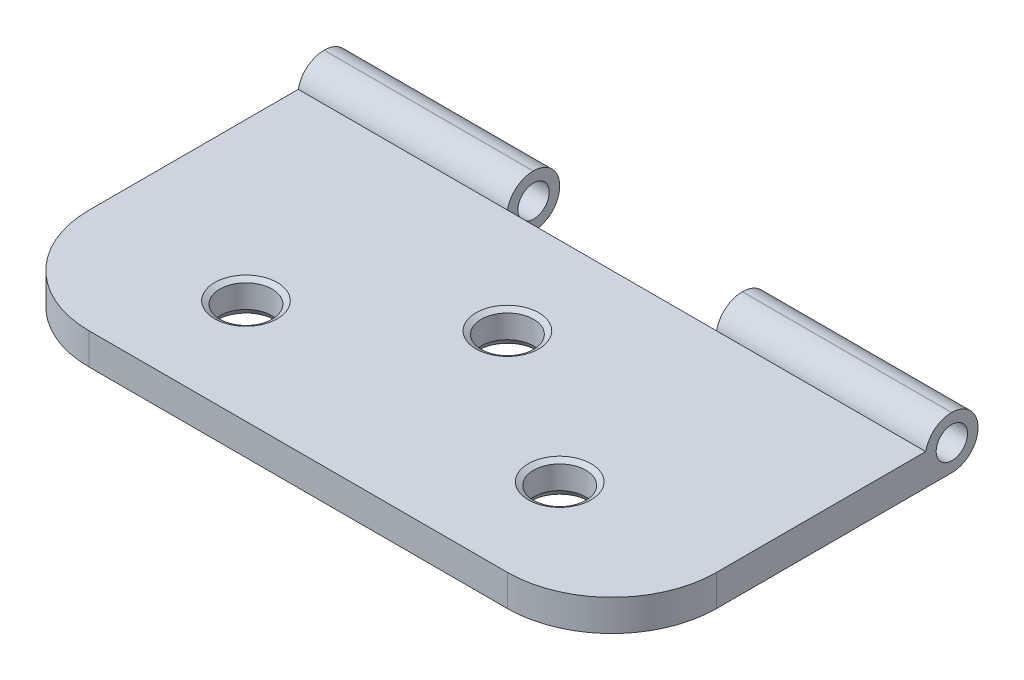
ISO-10303-21;
HEADER;
FILE_DESCRIPTION(('STEP AP214'),'2;1');
FILE_NAME('part.step','',(''),(''),'','','');
FILE_SCHEMA(('AUTOMOTIVE_DESIGN { 1 0 10303 214 1 1 1 1 }'));
ENDSEC;
DATA;
#1=APPLICATION_CONTEXT('core data for automotive mechanical design processes');
#2=APPLICATION_PROTOCOL_DEFINITION('international standard','automotive_design',2000,#1);
#3=PRODUCT_CONTEXT('',#1,'mechanical');
#4=PRODUCT('Part','Part','',(#3));
#5=PRODUCT_RELATED_PRODUCT_CATEGORY('part','',(#4));
#6=PRODUCT_DEFINITION_FORMATION('','',#4);
#7=PRODUCT_DEFINITION_CONTEXT('part definition',#1,'design');
#8=PRODUCT_DEFINITION('design','',#6,#7);
#9=PRODUCT_DEFINITION_SHAPE('','',#8);
#10=(LENGTH_UNIT() NAMED_UNIT(*) SI_UNIT(.MILLI.,.METRE.));
#11=(NAMED_UNIT(*) PLANE_ANGLE_UNIT() SI_UNIT($,.RADIAN.));
#12=(NAMED_UNIT(*) SI_UNIT($,.STERADIAN.) SOLID_ANGLE_UNIT());
#13=UNCERTAINTY_MEASURE_WITH_UNIT(LENGTH_MEASURE(1.E-05),#10,'distance_accuracy_value','');
#14=(GEOMETRIC_REPRESENTATION_CONTEXT(3) GLOBAL_UNCERTAINTY_ASSIGNED_CONTEXT((#13)) GLOBAL_UNIT_ASSIGNED_CONTEXT((#10,
#11,#12)) REPRESENTATION_CONTEXT('',''));
#15=CARTESIAN_POINT('',(0.,0.,0.));
#16=DIRECTION('',(0.,0.,1.));
#17=DIRECTION('',(1.,0.,0.));
#18=AXIS2_PLACEMENT_3D('',#15,#16,#17);
#19=CARTESIAN_POINT('',(0.,3.,0.));
#20=DIRECTION('',(0.,1.,0.));
#21=DIRECTION('',(0.,0.,1.));
#22=AXIS2_PLACEMENT_3D('',#19,#20,#21);
#23=PLANE('',#22);
#24=CARTESIAN_POINT('',(-15.,3.,5.));
#25=DIRECTION('',(0.,1.,0.));
#26=DIRECTION('',(0.,0.,1.));
#27=AXIS2_PLACEMENT_3D('',#24,#25,#26);
#28=CIRCLE('',#27,3.00000000000002);
#29=CARTESIAN_POINT('',(-15.,3.,8.00000000000001));
#30=VERTEX_POINT('',#29);
#31=EDGE_CURVE('E11',#30,#30,#28,.F.);
#32=ORIENTED_EDGE('',*,*,#31,.T.);
#33=EDGE_LOOP('',(#32));
#34=FACE_BOUND('',#33,.T.);
#35=CARTESIAN_POINT('',(0.,3.,-5.));
#36=DIRECTION('',(0.,1.,0.));
#37=DIRECTION('',(0.,0.,1.));
#38=AXIS2_PLACEMENT_3D('',#35,#36,#37);
#39=CIRCLE('',#38,3.00000000000002);
#40=CARTESIAN_POINT('',(0.,3.,-1.99999999999999));
#41=VERTEX_POINT('',#40);
#42=EDGE_CURVE('E40',#41,#41,#39,.F.);
#43=ORIENTED_EDGE('',*,*,#42,.T.);
#44=EDGE_LOOP('',(#43));
#45=FACE_BOUND('',#44,.T.);
#46=CARTESIAN_POINT('',(15.,3.,5.));
#47=DIRECTION('',(0.,1.,0.));
#48=DIRECTION('',(0.,0.,1.));
#49=AXIS2_PLACEMENT_3D('',#46,#47,#48);
#50=CIRCLE('',#49,3.00000000000002);
#51=CARTESIAN_POINT('',(15.,3.,8.00000000000001));
#52=VERTEX_POINT('',#51);
#53=EDGE_CURVE('E253',#52,#52,#50,.F.);
#54=ORIENTED_EDGE('',*,*,#53,.T.);
#55=EDGE_LOOP('',(#54));
#56=FACE_BOUND('',#55,.T.);
#57=DIRECTION('',(1.,0.,0.));
#58=VECTOR('',#57,1.);
#59=CARTESIAN_POINT('',(-30.,3.,15.));
#60=LINE('',#59,#58);
#61=CARTESIAN_POINT('',(-20.,3.,15.));
#62=VERTEX_POINT('',#61);
#63=CARTESIAN_POINT('',(20.,3.,15.));
#64=VERTEX_POINT('',#63);
#65=EDGE_CURVE('E410',#62,#64,#60,.T.);
#66=ORIENTED_EDGE('',*,*,#65,.T.);
#67=CARTESIAN_POINT('',(20.,3.,5.));
#68=DIRECTION('',(0.,1.,0.));
#69=DIRECTION('',(0.,0.,1.));
#70=AXIS2_PLACEMENT_3D('',#67,#68,#69);
#71=CIRCLE('',#70,10.);
#72=CARTESIAN_POINT('',(30.,3.,5.));
#73=VERTEX_POINT('',#72);
#74=EDGE_CURVE('E223',#64,#73,#71,.T.);
#75=ORIENTED_EDGE('',*,*,#74,.T.);
#76=DIRECTION('',(0.,0.,-1.));
#77=VECTOR('',#76,1.);
#78=CARTESIAN_POINT('',(30.,3.,-15.));
#79=LINE('',#78,#77);
#80=CARTESIAN_POINT('',(30.,3.,-15.));
#81=VERTEX_POINT('',#80);
#82=EDGE_CURVE('E148',#73,#81,#79,.T.);
#83=ORIENTED_EDGE('',*,*,#82,.T.);
#84=DIRECTION('',(1.,0.,0.));
#85=VECTOR('',#84,1.);
#86=CARTESIAN_POINT('',(10.,3.,-15.));
#87=LINE('',#86,#85);
#88=CARTESIAN_POINT('',(10.,3.,-15.));
#89=VERTEX_POINT('',#88);
#90=EDGE_CURVE('E143',#89,#81,#87,.T.);
#91=ORIENTED_EDGE('',*,*,#90,.F.);
#92=DIRECTION('',(-1.,0.,0.));
#93=VECTOR('',#92,1.);
#94=CARTESIAN_POINT('',(-30.,3.,-15.));
#95=LINE('',#94,#93);
#96=CARTESIAN_POINT('',(-10.,3.,-15.));
#97=VERTEX_POINT('',#96);
#98=EDGE_CURVE('E145',#89,#97,#95,.T.);
#99=ORIENTED_EDGE('',*,*,#98,.T.);
#100=DIRECTION('',(1.,0.,0.));
#101=VECTOR('',#100,1.);
#102=CARTESIAN_POINT('',(-30.,3.,-15.));
#103=LINE('',#102,#101);
#104=CARTESIAN_POINT('',(-30.,3.,-15.));
#105=VERTEX_POINT('',#104);
#106=EDGE_CURVE('E394',#105,#97,#103,.T.);
#107=ORIENTED_EDGE('',*,*,#106,.F.);
#108=DIRECTION('',(0.,0.,1.));
#109=VECTOR('',#108,1.);
#110=CARTESIAN_POINT('',(-30.,3.,-15.));
#111=LINE('',#110,#109);
#112=CARTESIAN_POINT('',(-30.,3.,5.));
#113=VERTEX_POINT('',#112);
#114=EDGE_CURVE('E165',#105,#113,#111,.T.);
#115=ORIENTED_EDGE('',*,*,#114,.T.);
#116=CARTESIAN_POINT('',(-20.,3.,5.));
#117=DIRECTION('',(0.,1.,0.));
#118=DIRECTION('',(0.,0.,1.));
#119=AXIS2_PLACEMENT_3D('',#116,#117,#118);
#120=CIRCLE('',#119,10.);
#121=EDGE_CURVE('E221',#113,#62,#120,.T.);
#122=ORIENTED_EDGE('',*,*,#121,.T.);
#123=EDGE_LOOP('',(#66,#75,#83,#91,#99,#107,#115,#122));
#124=FACE_BOUND('',#123,.T.);
#125=ADVANCED_FACE('F32',(#34,#45,#56,#124),#23,.T.);
#126=CARTESIAN_POINT('',(-30.,3.,-15.));
#127=DIRECTION('',(0.,0.,1.));
#128=DIRECTION('',(1.,0.,0.));
#129=AXIS2_PLACEMENT_3D('',#126,#127,#128);
#130=PLANE('',#129);
#131=DIRECTION('',(0.,-1.,0.));
#132=VECTOR('',#131,1.);
#133=CARTESIAN_POINT('',(-10.,0.,-15.));
#134=LINE('',#133,#132);
#135=CARTESIAN_POINT('',(-10.,0.,-15.));
#136=VERTEX_POINT('',#135);
#137=EDGE_CURVE('E163',#97,#136,#134,.T.);
#138=ORIENTED_EDGE('',*,*,#137,.F.);
#139=ORIENTED_EDGE('',*,*,#98,.F.);
#140=DIRECTION('',(0.,1.,0.));
#141=VECTOR('',#140,1.);
#142=CARTESIAN_POINT('',(10.,0.,-15.));
#143=LINE('',#142,#141);
#144=CARTESIAN_POINT('',(9.99999999999999,0.,-15.));
#145=VERTEX_POINT('',#144);
#146=EDGE_CURVE('E160',#145,#89,#143,.T.);
#147=ORIENTED_EDGE('',*,*,#146,.F.);
#148=DIRECTION('',(-1.,0.,0.));
#149=VECTOR('',#148,1.);
#150=CARTESIAN_POINT('',(-30.,0.,-15.));
#151=LINE('',#150,#149);
#152=EDGE_CURVE('E414',#145,#136,#151,.T.);
#153=ORIENTED_EDGE('',*,*,#152,.T.);
#154=EDGE_LOOP('',(#138,#139,#147,#153));
#155=FACE_BOUND('',#154,.T.);
#156=ADVANCED_FACE('F158',(#155),#130,.F.);
#157=CARTESIAN_POINT('',(30.,3.,-15.));
#158=DIRECTION('',(-1.,0.,0.));
#159=DIRECTION('',(0.,0.,1.));
#160=AXIS2_PLACEMENT_3D('',#157,#158,#159);
#161=PLANE('',#160);
#162=CARTESIAN_POINT('',(30.,2.5,-17.5));
#163=DIRECTION('',(1.,0.,0.));
#164=DIRECTION('',(0.,0.,-1.));
#165=AXIS2_PLACEMENT_3D('',#162,#163,#164);
#166=CIRCLE('',#165,1.5);
#167=CARTESIAN_POINT('',(30.,2.5,-19.));
#168=VERTEX_POINT('',#167);
#169=EDGE_CURVE('E384',#168,#168,#166,.T.);
#170=ORIENTED_EDGE('',*,*,#169,.F.);
#171=EDGE_LOOP('',(#170));
#172=FACE_BOUND('',#171,.T.);
#173=ORIENTED_EDGE('',*,*,#82,.F.);
#174=DIRECTION('',(0.,-1.,0.));
#175=VECTOR('',#174,1.);
#176=CARTESIAN_POINT('',(30.,3.,5.));
#177=LINE('',#176,#175);
#178=CARTESIAN_POINT('',(30.,0.,5.));
#179=VERTEX_POINT('',#178);
#180=EDGE_CURVE('E200',#73,#179,#177,.T.);
#181=ORIENTED_EDGE('',*,*,#180,.T.);
#182=DIRECTION('',(0.,0.,-1.));
#183=VECTOR('',#182,1.);
#184=CARTESIAN_POINT('',(30.,0.,-15.));
#185=LINE('',#184,#183);
#186=CARTESIAN_POINT('',(30.,0.,-17.5));
#187=VERTEX_POINT('',#186);
#188=EDGE_CURVE('E406',#179,#187,#185,.T.);
#189=ORIENTED_EDGE('',*,*,#188,.T.);
#190=CARTESIAN_POINT('',(30.,2.5,-17.5));
#191=DIRECTION('',(-1.,0.,0.));
#192=DIRECTION('',(0.,0.,1.));
#193=AXIS2_PLACEMENT_3D('',#190,#191,#192);
#194=CIRCLE('',#193,2.5);
#195=CARTESIAN_POINT('',(30.,2.5,-20.));
#196=VERTEX_POINT('',#195);
#197=EDGE_CURVE('E195',#187,#196,#194,.F.);
#198=ORIENTED_EDGE('',*,*,#197,.T.);
#199=CARTESIAN_POINT('',(30.,2.5,-17.5));
#200=DIRECTION('',(-1.,0.,0.));
#201=DIRECTION('',(0.,0.,1.));
#202=AXIS2_PLACEMENT_3D('',#199,#200,#201);
#203=CIRCLE('',#202,2.5);
#204=CARTESIAN_POINT('',(30.,5.,-17.5));
#205=VERTEX_POINT('',#204);
#206=EDGE_CURVE('E193',#196,#205,#203,.F.);
#207=ORIENTED_EDGE('',*,*,#206,.T.);
#208=DIRECTION('',(0.,0.,-1.));
#209=VECTOR('',#208,1.);
#210=CARTESIAN_POINT('',(30.,5.,-20.));
#211=LINE('',#210,#209);
#212=CARTESIAN_POINT('',(30.,5.,-17.4494897427832));
#213=VERTEX_POINT('',#212);
#214=EDGE_CURVE('E392',#213,#205,#211,.T.);
#215=ORIENTED_EDGE('',*,*,#214,.F.);
#216=CARTESIAN_POINT('',(30.,2.5,-17.4494897427832));
#217=DIRECTION('',(-1.,0.,0.));
#218=DIRECTION('',(0.,0.,1.));
#219=AXIS2_PLACEMENT_3D('',#216,#217,#218);
#220=CIRCLE('',#219,2.5);
#221=EDGE_CURVE('E191',#213,#81,#220,.F.);
#222=ORIENTED_EDGE('',*,*,#221,.T.);
#223=EDGE_LOOP('',(#173,#181,#189,#198,#207,#215,#222));
#224=FACE_BOUND('',#223,.T.);
#225=ADVANCED_FACE('F289',(#172,#224),#161,.F.);
#226=CARTESIAN_POINT('',(-30.,3.,-15.));
#227=DIRECTION('',(1.,0.,0.));
#228=DIRECTION('',(0.,0.,-1.));
#229=AXIS2_PLACEMENT_3D('',#226,#227,#228);
#230=PLANE('',#229);
#231=CARTESIAN_POINT('',(-30.,2.5,-17.5));
#232=DIRECTION('',(1.,0.,0.));
#233=DIRECTION('',(0.,0.,-1.));
#234=AXIS2_PLACEMENT_3D('',#231,#232,#233);
#235=CIRCLE('',#234,1.5);
#236=CARTESIAN_POINT('',(-30.,2.5,-19.));
#237=VERTEX_POINT('',#236);
#238=EDGE_CURVE('E210',#237,#237,#235,.T.);
#239=ORIENTED_EDGE('',*,*,#238,.T.);
#240=EDGE_LOOP('',(#239));
#241=FACE_BOUND('',#240,.T.);
#242=DIRECTION('',(0.,0.,1.));
#243=VECTOR('',#242,1.);
#244=CARTESIAN_POINT('',(-30.,0.,-15.));
#245=LINE('',#244,#243);
#246=CARTESIAN_POINT('',(-30.,0.,-17.5));
#247=VERTEX_POINT('',#246);
#248=CARTESIAN_POINT('',(-30.,0.,5.));
#249=VERTEX_POINT('',#248);
#250=EDGE_CURVE('E416',#247,#249,#245,.T.);
#251=ORIENTED_EDGE('',*,*,#250,.T.);
#252=DIRECTION('',(0.,-1.,0.));
#253=VECTOR('',#252,1.);
#254=CARTESIAN_POINT('',(-30.,3.,5.));
#255=LINE('',#254,#253);
#256=EDGE_CURVE('E47',#249,#113,#255,.F.);
#257=ORIENTED_EDGE('',*,*,#256,.T.);
#258=ORIENTED_EDGE('',*,*,#114,.F.);
#259=CARTESIAN_POINT('',(-30.,2.5,-17.4494897427832));
#260=DIRECTION('',(1.,0.,0.));
#261=DIRECTION('',(0.,0.,-1.));
#262=AXIS2_PLACEMENT_3D('',#259,#260,#261);
#263=CIRCLE('',#262,2.5);
#264=CARTESIAN_POINT('',(-30.,5.,-17.4494897427832));
#265=VERTEX_POINT('',#264);
#266=EDGE_CURVE('E422',#105,#265,#263,.F.);
#267=ORIENTED_EDGE('',*,*,#266,.T.);
#268=DIRECTION('',(0.,0.,1.));
#269=VECTOR('',#268,1.);
#270=CARTESIAN_POINT('',(-30.,5.,-20.));
#271=LINE('',#270,#269);
#272=CARTESIAN_POINT('',(-30.,5.,-17.5));
#273=VERTEX_POINT('',#272);
#274=EDGE_CURVE('E396',#273,#265,#271,.T.);
#275=ORIENTED_EDGE('',*,*,#274,.F.);
#276=CARTESIAN_POINT('',(-30.,2.5,-17.5));
#277=DIRECTION('',(1.,0.,0.));
#278=DIRECTION('',(0.,0.,-1.));
#279=AXIS2_PLACEMENT_3D('',#276,#277,#278);
#280=CIRCLE('',#279,2.5);
#281=CARTESIAN_POINT('',(-30.,2.5,-20.));
#282=VERTEX_POINT('',#281);
#283=EDGE_CURVE('E412',#273,#282,#280,.F.);
#284=ORIENTED_EDGE('',*,*,#283,.T.);
#285=CARTESIAN_POINT('',(-30.,2.5,-17.5));
#286=DIRECTION('',(1.,0.,0.));
#287=DIRECTION('',(0.,0.,-1.));
#288=AXIS2_PLACEMENT_3D('',#285,#286,#287);
#289=CIRCLE('',#288,2.5);
#290=EDGE_CURVE('E420',#282,#247,#289,.F.);
#291=ORIENTED_EDGE('',*,*,#290,.T.);
#292=EDGE_LOOP('',(#251,#257,#258,#267,#275,#284,#291));
#293=FACE_BOUND('',#292,.T.);
#294=ADVANCED_FACE('F294',(#241,#293),#230,.F.);
#295=CARTESIAN_POINT('',(-30.,3.,15.));
#296=DIRECTION('',(0.,0.,-1.));
#297=DIRECTION('',(-1.,0.,0.));
#298=AXIS2_PLACEMENT_3D('',#295,#296,#297);
#299=PLANE('',#298);
#300=DIRECTION('',(1.,0.,0.));
#301=VECTOR('',#300,1.);
#302=CARTESIAN_POINT('',(-30.,0.,15.));
#303=LINE('',#302,#301);
#304=CARTESIAN_POINT('',(-20.,0.,15.));
#305=VERTEX_POINT('',#304);
#306=CARTESIAN_POINT('',(20.,0.,15.));
#307=VERTEX_POINT('',#306);
#308=EDGE_CURVE('E407',#305,#307,#303,.T.);
#309=ORIENTED_EDGE('',*,*,#308,.T.);
#310=DIRECTION('',(0.,-1.,0.));
#311=VECTOR('',#310,1.);
#312=CARTESIAN_POINT('',(20.,3.,15.));
#313=LINE('',#312,#311);
#314=EDGE_CURVE('E55',#307,#64,#313,.F.);
#315=ORIENTED_EDGE('',*,*,#314,.T.);
#316=ORIENTED_EDGE('',*,*,#65,.F.);
#317=DIRECTION('',(0.,-1.,0.));
#318=VECTOR('',#317,1.);
#319=CARTESIAN_POINT('',(-20.,3.,15.));
#320=LINE('',#319,#318);
#321=EDGE_CURVE('E217',#62,#305,#320,.T.);
#322=ORIENTED_EDGE('',*,*,#321,.T.);
#323=EDGE_LOOP('',(#309,#315,#316,#322));
#324=FACE_BOUND('',#323,.T.);
#325=ADVANCED_FACE('F279',(#324),#299,.F.);
#326=CARTESIAN_POINT('',(0.,0.,0.));
#327=DIRECTION('',(0.,1.,0.));
#328=DIRECTION('',(0.,0.,1.));
#329=AXIS2_PLACEMENT_3D('',#326,#327,#328);
#330=PLANE('',#329);
#331=CARTESIAN_POINT('',(15.,0.,5.));
#332=DIRECTION('',(0.,1.,0.));
#333=DIRECTION('',(0.,0.,1.));
#334=AXIS2_PLACEMENT_3D('',#331,#332,#333);
#335=CIRCLE('',#334,2.78867513459482);
#336=CARTESIAN_POINT('',(15.,0.,7.78867513459482));
#337=VERTEX_POINT('',#336);
#338=EDGE_CURVE('E232',#337,#337,#335,.T.);
#339=ORIENTED_EDGE('',*,*,#338,.T.);
#340=EDGE_LOOP('',(#339));
#341=FACE_BOUND('',#340,.T.);
#342=CARTESIAN_POINT('',(-15.,0.,5.));
#343=DIRECTION('',(0.,1.,0.));
#344=DIRECTION('',(0.,0.,1.));
#345=AXIS2_PLACEMENT_3D('',#342,#343,#344);
#346=CIRCLE('',#345,2.78867513459482);
#347=CARTESIAN_POINT('',(-15.,0.,7.78867513459482));
#348=VERTEX_POINT('',#347);
#349=EDGE_CURVE('E229',#348,#348,#346,.T.);
#350=ORIENTED_EDGE('',*,*,#349,.T.);
#351=EDGE_LOOP('',(#350));
#352=FACE_BOUND('',#351,.T.);
#353=CARTESIAN_POINT('',(0.,0.,-5.));
#354=DIRECTION('',(0.,1.,0.));
#355=DIRECTION('',(0.,0.,1.));
#356=AXIS2_PLACEMENT_3D('',#353,#354,#355);
#357=CIRCLE('',#356,2.78867513459482);
#358=CARTESIAN_POINT('',(0.,0.,-2.21132486540519));
#359=VERTEX_POINT('',#358);
#360=EDGE_CURVE('E226',#359,#359,#357,.T.);
#361=ORIENTED_EDGE('',*,*,#360,.T.);
#362=EDGE_LOOP('',(#361));
#363=FACE_BOUND('',#362,.T.);
#364=ORIENTED_EDGE('',*,*,#188,.F.);
#365=CARTESIAN_POINT('',(20.,0.,5.));
#366=DIRECTION('',(0.,1.,0.));
#367=DIRECTION('',(0.,0.,1.));
#368=AXIS2_PLACEMENT_3D('',#365,#366,#367);
#369=CIRCLE('',#368,10.);
#370=EDGE_CURVE('E215',#179,#307,#369,.F.);
#371=ORIENTED_EDGE('',*,*,#370,.T.);
#372=ORIENTED_EDGE('',*,*,#308,.F.);
#373=CARTESIAN_POINT('',(-20.,0.,5.));
#374=DIRECTION('',(0.,1.,0.));
#375=DIRECTION('',(0.,0.,1.));
#376=AXIS2_PLACEMENT_3D('',#373,#374,#375);
#377=CIRCLE('',#376,10.);
#378=EDGE_CURVE('E213',#305,#249,#377,.F.);
#379=ORIENTED_EDGE('',*,*,#378,.T.);
#380=ORIENTED_EDGE('',*,*,#250,.F.);
#381=DIRECTION('',(-1.,0.,0.));
#382=VECTOR('',#381,1.);
#383=CARTESIAN_POINT('',(-10.,0.,-17.5));
#384=LINE('',#383,#382);
#385=CARTESIAN_POINT('',(-10.,0.,-17.5));
#386=VERTEX_POINT('',#385);
#387=EDGE_CURVE('E427',#247,#386,#384,.F.);
#388=ORIENTED_EDGE('',*,*,#387,.T.);
#389=DIRECTION('',(0.,0.,1.));
#390=VECTOR('',#389,1.);
#391=CARTESIAN_POINT('',(-10.,0.,-20.));
#392=LINE('',#391,#390);
#393=EDGE_CURVE('E174',#386,#136,#392,.T.);
#394=ORIENTED_EDGE('',*,*,#393,.T.);
#395=ORIENTED_EDGE('',*,*,#152,.F.);
#396=DIRECTION('',(0.,0.,1.));
#397=VECTOR('',#396,1.);
#398=CARTESIAN_POINT('',(10.,0.,-20.));
#399=LINE('',#398,#397);
#400=CARTESIAN_POINT('',(10.,0.,-17.5));
#401=VERTEX_POINT('',#400);
#402=EDGE_CURVE('E173',#401,#145,#399,.T.);
#403=ORIENTED_EDGE('',*,*,#402,.F.);
#404=DIRECTION('',(-1.,0.,0.));
#405=VECTOR('',#404,1.);
#406=CARTESIAN_POINT('',(0.,0.,-17.5));
#407=LINE('',#406,#405);
#408=EDGE_CURVE('E424',#401,#187,#407,.F.);
#409=ORIENTED_EDGE('',*,*,#408,.T.);
#410=EDGE_LOOP('',(#364,#371,#372,#379,#380,#388,#394,#395,#403,#409));
#411=FACE_BOUND('',#410,.T.);
#412=ADVANCED_FACE('F269',(#341,#352,#363,#411),#330,.F.);
#413=CARTESIAN_POINT('',(0.,-2.,-5.));
#414=DIRECTION('',(0.,1.,0.));
#415=DIRECTION('',(0.,0.,1.));
#416=AXIS2_PLACEMENT_3D('',#413,#414,#415);
#417=CYLINDRICAL_SURFACE('',#416,2.5);
#418=CARTESIAN_POINT('',(0.,0.500000000000004,-5.));
#419=DIRECTION('',(0.,1.,0.));
#420=DIRECTION('',(0.,0.,1.));
#421=AXIS2_PLACEMENT_3D('',#418,#419,#420);
#422=CIRCLE('',#421,2.5);
#423=CARTESIAN_POINT('',(0.,0.500000000000004,-2.5));
#424=VERTEX_POINT('',#423);
#425=EDGE_CURVE('E250',#424,#424,#422,.F.);
#426=ORIENTED_EDGE('',*,*,#425,.T.);
#427=EDGE_LOOP('',(#426));
#428=FACE_BOUND('',#427,.T.);
#429=CARTESIAN_POINT('',(0.,2.71132486540518,-5.));
#430=DIRECTION('',(0.,1.,0.));
#431=DIRECTION('',(0.,0.,1.));
#432=AXIS2_PLACEMENT_3D('',#429,#430,#431);
#433=CIRCLE('',#432,2.5);
#434=CARTESIAN_POINT('',(0.,2.71132486540518,-2.5));
#435=VERTEX_POINT('',#434);
#436=EDGE_CURVE('E247',#435,#435,#433,.T.);
#437=ORIENTED_EDGE('',*,*,#436,.T.);
#438=EDGE_LOOP('',(#437));
#439=FACE_BOUND('',#438,.T.);
#440=ADVANCED_FACE('F266',(#428,#439),#417,.F.);
#441=CARTESIAN_POINT('',(15.,-2.,5.));
#442=DIRECTION('',(0.,1.,0.));
#443=DIRECTION('',(0.,0.,1.));
#444=AXIS2_PLACEMENT_3D('',#441,#442,#443);
#445=CYLINDRICAL_SURFACE('',#444,2.5);
#446=CARTESIAN_POINT('',(15.,0.500000000000004,5.));
#447=DIRECTION('',(0.,1.,0.));
#448=DIRECTION('',(0.,0.,1.));
#449=AXIS2_PLACEMENT_3D('',#446,#447,#448);
#450=CIRCLE('',#449,2.5);
#451=CARTESIAN_POINT('',(15.,0.500000000000004,7.5));
#452=VERTEX_POINT('',#451);
#453=EDGE_CURVE('E238',#452,#452,#450,.F.);
#454=ORIENTED_EDGE('',*,*,#453,.T.);
#455=EDGE_LOOP('',(#454));
#456=FACE_BOUND('',#455,.T.);
#457=CARTESIAN_POINT('',(15.,2.71132486540518,5.));
#458=DIRECTION('',(0.,1.,0.));
#459=DIRECTION('',(0.,0.,1.));
#460=AXIS2_PLACEMENT_3D('',#457,#458,#459);
#461=CIRCLE('',#460,2.5);
#462=CARTESIAN_POINT('',(15.,2.71132486540518,7.5));
#463=VERTEX_POINT('',#462);
#464=EDGE_CURVE('E235',#463,#463,#461,.T.);
#465=ORIENTED_EDGE('',*,*,#464,.T.);
#466=EDGE_LOOP('',(#465));
#467=FACE_BOUND('',#466,.T.);
#468=ADVANCED_FACE('F268',(#456,#467),#445,.F.);
#469=CARTESIAN_POINT('',(-15.,-2.,5.));
#470=DIRECTION('',(0.,1.,0.));
#471=DIRECTION('',(0.,0.,1.));
#472=AXIS2_PLACEMENT_3D('',#469,#470,#471);
#473=CYLINDRICAL_SURFACE('',#472,2.5);
#474=CARTESIAN_POINT('',(-15.,0.500000000000004,5.));
#475=DIRECTION('',(0.,1.,0.));
#476=DIRECTION('',(0.,0.,1.));
#477=AXIS2_PLACEMENT_3D('',#474,#475,#476);
#478=CIRCLE('',#477,2.5);
#479=CARTESIAN_POINT('',(-15.,0.500000000000004,7.5));
#480=VERTEX_POINT('',#479);
#481=EDGE_CURVE('E244',#480,#480,#478,.F.);
#482=ORIENTED_EDGE('',*,*,#481,.T.);
#483=EDGE_LOOP('',(#482));
#484=FACE_BOUND('',#483,.T.);
#485=CARTESIAN_POINT('',(-15.,2.71132486540518,5.));
#486=DIRECTION('',(0.,1.,0.));
#487=DIRECTION('',(0.,0.,1.));
#488=AXIS2_PLACEMENT_3D('',#485,#486,#487);
#489=CIRCLE('',#488,2.5);
#490=CARTESIAN_POINT('',(-15.,2.71132486540518,7.5));
#491=VERTEX_POINT('',#490);
#492=EDGE_CURVE('E241',#491,#491,#489,.T.);
#493=ORIENTED_EDGE('',*,*,#492,.T.);
#494=EDGE_LOOP('',(#493));
#495=FACE_BOUND('',#494,.T.);
#496=ADVANCED_FACE('F276',(#484,#495),#473,.F.);
#497=CARTESIAN_POINT('',(10.,0.,-20.));
#498=DIRECTION('',(1.,0.,0.));
#499=DIRECTION('',(0.,0.,-1.));
#500=AXIS2_PLACEMENT_3D('',#497,#498,#499);
#501=PLANE('',#500);
#502=CARTESIAN_POINT('',(10.,2.5,-17.5));
#503=DIRECTION('',(1.,0.,0.));
#504=DIRECTION('',(0.,0.,-1.));
#505=AXIS2_PLACEMENT_3D('',#502,#503,#504);
#506=CIRCLE('',#505,1.5);
#507=CARTESIAN_POINT('',(10.,2.5,-19.));
#508=VERTEX_POINT('',#507);
#509=EDGE_CURVE('E206',#508,#508,#506,.T.);
#510=ORIENTED_EDGE('',*,*,#509,.T.);
#511=EDGE_LOOP('',(#510));
#512=FACE_BOUND('',#511,.T.);
#513=CARTESIAN_POINT('',(10.,2.5,-17.5));
#514=DIRECTION('',(1.,0.,0.));
#515=DIRECTION('',(0.,0.,-1.));
#516=AXIS2_PLACEMENT_3D('',#513,#514,#515);
#517=CIRCLE('',#516,2.5);
#518=CARTESIAN_POINT('',(10.,5.,-17.5));
#519=VERTEX_POINT('',#518);
#520=CARTESIAN_POINT('',(10.,2.5,-20.));
#521=VERTEX_POINT('',#520);
#522=EDGE_CURVE('E180',#519,#521,#517,.F.);
#523=ORIENTED_EDGE('',*,*,#522,.T.);
#524=CARTESIAN_POINT('',(10.,2.5,-17.5));
#525=DIRECTION('',(1.,0.,0.));
#526=DIRECTION('',(0.,0.,-1.));
#527=AXIS2_PLACEMENT_3D('',#524,#525,#526);
#528=CIRCLE('',#527,2.5);
#529=EDGE_CURVE('E183',#521,#401,#528,.F.);
#530=ORIENTED_EDGE('',*,*,#529,.T.);
#531=ORIENTED_EDGE('',*,*,#402,.T.);
#532=ORIENTED_EDGE('',*,*,#146,.T.);
#533=CARTESIAN_POINT('',(10.,2.5,-17.4494897427832));
#534=DIRECTION('',(1.,0.,0.));
#535=DIRECTION('',(0.,0.,-1.));
#536=AXIS2_PLACEMENT_3D('',#533,#534,#535);
#537=CIRCLE('',#536,2.5);
#538=CARTESIAN_POINT('',(10.,5.,-17.4494897427832));
#539=VERTEX_POINT('',#538);
#540=EDGE_CURVE('E170',#89,#539,#537,.F.);
#541=ORIENTED_EDGE('',*,*,#540,.T.);
#542=DIRECTION('',(0.,0.,1.));
#543=VECTOR('',#542,1.);
#544=CARTESIAN_POINT('',(10.,5.,-20.));
#545=LINE('',#544,#543);
#546=EDGE_CURVE('E152',#519,#539,#545,.T.);
#547=ORIENTED_EDGE('',*,*,#546,.F.);
#548=EDGE_LOOP('',(#523,#530,#531,#532,#541,#547));
#549=FACE_BOUND('',#548,.T.);
#550=ADVANCED_FACE('F168',(#512,#549),#501,.F.);
#551=CARTESIAN_POINT('',(-10.,0.,-20.));
#552=DIRECTION('',(-1.,0.,0.));
#553=DIRECTION('',(0.,-1.,0.));
#554=AXIS2_PLACEMENT_3D('',#551,#552,#553);
#555=PLANE('',#554);
#556=CARTESIAN_POINT('',(-10.,2.5,-17.5));
#557=DIRECTION('',(-1.,0.,0.));
#558=DIRECTION('',(0.,-1.,0.));
#559=AXIS2_PLACEMENT_3D('',#556,#557,#558);
#560=CIRCLE('',#559,1.5);
#561=CARTESIAN_POINT('',(-10.,0.999999999999999,-17.5));
#562=VERTEX_POINT('',#561);
#563=EDGE_CURVE('E207',#562,#562,#560,.T.);
#564=ORIENTED_EDGE('',*,*,#563,.T.);
#565=EDGE_LOOP('',(#564));
#566=FACE_BOUND('',#565,.T.);
#567=DIRECTION('',(0.,0.,-1.));
#568=VECTOR('',#567,1.);
#569=CARTESIAN_POINT('',(-10.,5.,-20.));
#570=LINE('',#569,#568);
#571=CARTESIAN_POINT('',(-10.,5.,-17.4494897427832));
#572=VERTEX_POINT('',#571);
#573=CARTESIAN_POINT('',(-10.,5.,-17.5));
#574=VERTEX_POINT('',#573);
#575=EDGE_CURVE('E399',#572,#574,#570,.T.);
#576=ORIENTED_EDGE('',*,*,#575,.F.);
#577=CARTESIAN_POINT('',(-10.,2.5,-17.4494897427832));
#578=DIRECTION('',(-1.,0.,0.));
#579=DIRECTION('',(0.,-1.,0.));
#580=AXIS2_PLACEMENT_3D('',#577,#578,#579);
#581=CIRCLE('',#580,2.5);
#582=EDGE_CURVE('E434',#572,#97,#581,.F.);
#583=ORIENTED_EDGE('',*,*,#582,.T.);
#584=ORIENTED_EDGE('',*,*,#137,.T.);
#585=ORIENTED_EDGE('',*,*,#393,.F.);
#586=CARTESIAN_POINT('',(-10.,2.5,-17.5));
#587=DIRECTION('',(-1.,0.,0.));
#588=DIRECTION('',(0.,-1.,0.));
#589=AXIS2_PLACEMENT_3D('',#586,#587,#588);
#590=CIRCLE('',#589,2.5);
#591=CARTESIAN_POINT('',(-10.,2.5,-20.));
#592=VERTEX_POINT('',#591);
#593=EDGE_CURVE('E432',#386,#592,#590,.F.);
#594=ORIENTED_EDGE('',*,*,#593,.T.);
#595=CARTESIAN_POINT('',(-10.,2.5,-17.5));
#596=DIRECTION('',(-1.,0.,0.));
#597=DIRECTION('',(0.,-1.,0.));
#598=AXIS2_PLACEMENT_3D('',#595,#596,#597);
#599=CIRCLE('',#598,2.5);
#600=EDGE_CURVE('E430',#592,#574,#599,.F.);
#601=ORIENTED_EDGE('',*,*,#600,.T.);
#602=EDGE_LOOP('',(#576,#583,#584,#585,#594,#601));
#603=FACE_BOUND('',#602,.T.);
#604=ADVANCED_FACE('F361',(#566,#603),#555,.F.);
#605=CARTESIAN_POINT('',(0.,5.,0.));
#606=DIRECTION('',(0.,1.,0.));
#607=DIRECTION('',(0.,0.,1.));
#608=AXIS2_PLACEMENT_3D('',#605,#606,#607);
#609=PLANE('',#608);
#610=ORIENTED_EDGE('',*,*,#274,.T.);
#611=DIRECTION('',(-1.,0.,0.));
#612=VECTOR('',#611,1.);
#613=CARTESIAN_POINT('',(-10.,5.,-17.4494897427832));
#614=LINE('',#613,#612);
#615=EDGE_CURVE('E181',#265,#572,#614,.F.);
#616=ORIENTED_EDGE('',*,*,#615,.T.);
#617=ORIENTED_EDGE('',*,*,#575,.T.);
#618=DIRECTION('',(-1.,0.,0.));
#619=VECTOR('',#618,1.);
#620=CARTESIAN_POINT('',(0.,5.,-17.5));
#621=LINE('',#620,#619);
#622=EDGE_CURVE('E186',#574,#273,#621,.T.);
#623=ORIENTED_EDGE('',*,*,#622,.T.);
#624=EDGE_LOOP('',(#610,#616,#617,#623));
#625=FACE_BOUND('',#624,.T.);
#626=ADVANCED_FACE('F367',(#625),#609,.T.);
#627=CARTESIAN_POINT('',(0.,5.,0.));
#628=DIRECTION('',(0.,1.,0.));
#629=DIRECTION('',(0.,0.,1.));
#630=AXIS2_PLACEMENT_3D('',#627,#628,#629);
#631=PLANE('',#630);
#632=ORIENTED_EDGE('',*,*,#214,.T.);
#633=DIRECTION('',(-1.,0.,0.));
#634=VECTOR('',#633,1.);
#635=CARTESIAN_POINT('',(10.,5.,-17.5));
#636=LINE('',#635,#634);
#637=EDGE_CURVE('E198',#205,#519,#636,.T.);
#638=ORIENTED_EDGE('',*,*,#637,.T.);
#639=ORIENTED_EDGE('',*,*,#546,.T.);
#640=DIRECTION('',(-1.,0.,0.));
#641=VECTOR('',#640,1.);
#642=CARTESIAN_POINT('',(30.,5.,-17.4494897427832));
#643=LINE('',#642,#641);
#644=EDGE_CURVE('E179',#539,#213,#643,.F.);
#645=ORIENTED_EDGE('',*,*,#644,.T.);
#646=EDGE_LOOP('',(#632,#638,#639,#645));
#647=FACE_BOUND('',#646,.T.);
#648=ADVANCED_FACE('F309',(#647),#631,.T.);
#649=CARTESIAN_POINT('',(0.,2.5,-17.5));
#650=DIRECTION('',(-1.,0.,0.));
#651=DIRECTION('',(0.,0.,1.));
#652=AXIS2_PLACEMENT_3D('',#649,#650,#651);
#653=CYLINDRICAL_SURFACE('',#652,2.5);
#654=ORIENTED_EDGE('',*,*,#622,.F.);
#655=ORIENTED_EDGE('',*,*,#600,.F.);
#656=DIRECTION('',(-1.,0.,0.));
#657=VECTOR('',#656,1.);
#658=CARTESIAN_POINT('',(0.,2.5,-20.));
#659=LINE('',#658,#657);
#660=EDGE_CURVE('E153',#282,#592,#659,.F.);
#661=ORIENTED_EDGE('',*,*,#660,.F.);
#662=ORIENTED_EDGE('',*,*,#283,.F.);
#663=EDGE_LOOP('',(#654,#655,#661,#662));
#664=FACE_BOUND('',#663,.T.);
#665=ADVANCED_FACE('F305',(#664),#653,.T.);
#666=CARTESIAN_POINT('',(0.,2.5,-17.5));
#667=DIRECTION('',(1.,0.,0.));
#668=DIRECTION('',(0.,0.,-1.));
#669=AXIS2_PLACEMENT_3D('',#666,#667,#668);
#670=CYLINDRICAL_SURFACE('',#669,2.5);
#671=ORIENTED_EDGE('',*,*,#593,.F.);
#672=ORIENTED_EDGE('',*,*,#387,.F.);
#673=ORIENTED_EDGE('',*,*,#290,.F.);
#674=ORIENTED_EDGE('',*,*,#660,.T.);
#675=EDGE_LOOP('',(#671,#672,#673,#674));
#676=FACE_BOUND('',#675,.T.);
#677=ADVANCED_FACE('F301',(#676),#670,.T.);
#678=CARTESIAN_POINT('',(-30.,2.5,-17.4494897427832));
#679=DIRECTION('',(1.,0.,0.));
#680=DIRECTION('',(0.,0.,-1.));
#681=AXIS2_PLACEMENT_3D('',#678,#679,#680);
#682=CYLINDRICAL_SURFACE('',#681,2.5);
#683=ORIENTED_EDGE('',*,*,#266,.F.);
#684=ORIENTED_EDGE('',*,*,#106,.T.);
#685=ORIENTED_EDGE('',*,*,#582,.F.);
#686=ORIENTED_EDGE('',*,*,#615,.F.);
#687=EDGE_LOOP('',(#683,#684,#685,#686));
#688=FACE_BOUND('',#687,.T.);
#689=ADVANCED_FACE('F304',(#688),#682,.T.);
#690=CARTESIAN_POINT('',(0.,2.5,-17.5));
#691=DIRECTION('',(1.,0.,0.));
#692=DIRECTION('',(0.,0.,-1.));
#693=AXIS2_PLACEMENT_3D('',#690,#691,#692);
#694=CYLINDRICAL_SURFACE('',#693,2.5);
#695=ORIENTED_EDGE('',*,*,#637,.F.);
#696=ORIENTED_EDGE('',*,*,#206,.F.);
#697=DIRECTION('',(-1.,0.,0.));
#698=VECTOR('',#697,1.);
#699=CARTESIAN_POINT('',(30.,2.5,-20.));
#700=LINE('',#699,#698);
#701=EDGE_CURVE('E203',#521,#196,#700,.F.);
#702=ORIENTED_EDGE('',*,*,#701,.F.);
#703=ORIENTED_EDGE('',*,*,#522,.F.);
#704=EDGE_LOOP('',(#695,#696,#702,#703));
#705=FACE_BOUND('',#704,.T.);
#706=ADVANCED_FACE('F313',(#705),#694,.T.);
#707=CARTESIAN_POINT('',(0.,2.5,-17.5));
#708=DIRECTION('',(-1.,0.,0.));
#709=DIRECTION('',(0.,0.,1.));
#710=AXIS2_PLACEMENT_3D('',#707,#708,#709);
#711=CYLINDRICAL_SURFACE('',#710,2.5);
#712=ORIENTED_EDGE('',*,*,#197,.F.);
#713=ORIENTED_EDGE('',*,*,#408,.F.);
#714=ORIENTED_EDGE('',*,*,#529,.F.);
#715=ORIENTED_EDGE('',*,*,#701,.T.);
#716=EDGE_LOOP('',(#712,#713,#714,#715));
#717=FACE_BOUND('',#716,.T.);
#718=ADVANCED_FACE('F315',(#717),#711,.T.);
#719=CARTESIAN_POINT('',(10.,2.5,-17.4494897427832));
#720=DIRECTION('',(1.,0.,0.));
#721=DIRECTION('',(0.,0.,-1.));
#722=AXIS2_PLACEMENT_3D('',#719,#720,#721);
#723=CYLINDRICAL_SURFACE('',#722,2.5);
#724=ORIENTED_EDGE('',*,*,#540,.F.);
#725=ORIENTED_EDGE('',*,*,#90,.T.);
#726=ORIENTED_EDGE('',*,*,#221,.F.);
#727=ORIENTED_EDGE('',*,*,#644,.F.);
#728=EDGE_LOOP('',(#724,#725,#726,#727));
#729=FACE_BOUND('',#728,.T.);
#730=ADVANCED_FACE('F177',(#729),#723,.T.);
#731=CARTESIAN_POINT('',(-30.,2.5,-17.5));
#732=DIRECTION('',(1.,0.,0.));
#733=DIRECTION('',(0.,0.,-1.));
#734=AXIS2_PLACEMENT_3D('',#731,#732,#733);
#735=CYLINDRICAL_SURFACE('',#734,1.5);
#736=ORIENTED_EDGE('',*,*,#238,.F.);
#737=EDGE_LOOP('',(#736));
#738=FACE_BOUND('',#737,.T.);
#739=ORIENTED_EDGE('',*,*,#563,.F.);
#740=EDGE_LOOP('',(#739));
#741=FACE_BOUND('',#740,.T.);
#742=ADVANCED_FACE('F324',(#738,#741),#735,.F.);
#743=ORIENTED_EDGE('',*,*,#169,.T.);
#744=EDGE_LOOP('',(#743));
#745=FACE_BOUND('',#744,.T.);
#746=ORIENTED_EDGE('',*,*,#509,.F.);
#747=EDGE_LOOP('',(#746));
#748=FACE_BOUND('',#747,.T.);
#749=ADVANCED_FACE('F329',(#745,#748),#735,.F.);
#750=CARTESIAN_POINT('',(20.,3.,5.));
#751=DIRECTION('',(0.,-1.,0.));
#752=DIRECTION('',(0.,0.,-1.));
#753=AXIS2_PLACEMENT_3D('',#750,#751,#752);
#754=CYLINDRICAL_SURFACE('',#753,10.);
#755=ORIENTED_EDGE('',*,*,#74,.F.);
#756=ORIENTED_EDGE('',*,*,#314,.F.);
#757=ORIENTED_EDGE('',*,*,#370,.F.);
#758=ORIENTED_EDGE('',*,*,#180,.F.);
#759=EDGE_LOOP('',(#755,#756,#757,#758));
#760=FACE_BOUND('',#759,.T.);
#761=ADVANCED_FACE('F325',(#760),#754,.T.);
#762=CARTESIAN_POINT('',(-20.,3.,5.));
#763=DIRECTION('',(0.,-1.,0.));
#764=DIRECTION('',(0.,0.,-1.));
#765=AXIS2_PLACEMENT_3D('',#762,#763,#764);
#766=CYLINDRICAL_SURFACE('',#765,10.);
#767=ORIENTED_EDGE('',*,*,#121,.F.);
#768=ORIENTED_EDGE('',*,*,#256,.F.);
#769=ORIENTED_EDGE('',*,*,#378,.F.);
#770=ORIENTED_EDGE('',*,*,#321,.F.);
#771=EDGE_LOOP('',(#767,#768,#769,#770));
#772=FACE_BOUND('',#771,.T.);
#773=ADVANCED_FACE('F328',(#772),#766,.T.);
#774=CARTESIAN_POINT('',(15.,0.,5.));
#775=DIRECTION('',(0.,-1.,0.));
#776=DIRECTION('',(0.,0.,-1.));
#777=AXIS2_PLACEMENT_3D('',#774,#775,#776);
#778=CONICAL_SURFACE('',#777,2.78867513459482,0.523598775598304);
#779=ORIENTED_EDGE('',*,*,#453,.F.);
#780=EDGE_LOOP('',(#779));
#781=FACE_BOUND('',#780,.T.);
#782=ORIENTED_EDGE('',*,*,#338,.F.);
#783=EDGE_LOOP('',(#782));
#784=FACE_BOUND('',#783,.T.);
#785=ADVANCED_FACE('F333',(#781,#784),#778,.F.);
#786=CARTESIAN_POINT('',(-15.,0.,5.));
#787=DIRECTION('',(0.,-1.,0.));
#788=DIRECTION('',(0.,0.,-1.));
#789=AXIS2_PLACEMENT_3D('',#786,#787,#788);
#790=CONICAL_SURFACE('',#789,2.78867513459482,0.523598775598304);
#791=ORIENTED_EDGE('',*,*,#481,.F.);
#792=EDGE_LOOP('',(#791));
#793=FACE_BOUND('',#792,.T.);
#794=ORIENTED_EDGE('',*,*,#349,.F.);
#795=EDGE_LOOP('',(#794));
#796=FACE_BOUND('',#795,.T.);
#797=ADVANCED_FACE('F337',(#793,#796),#790,.F.);
#798=CARTESIAN_POINT('',(0.,0.,-5.));
#799=DIRECTION('',(0.,-1.,0.));
#800=DIRECTION('',(0.,0.,-1.));
#801=AXIS2_PLACEMENT_3D('',#798,#799,#800);
#802=CONICAL_SURFACE('',#801,2.78867513459482,0.523598775598304);
#803=ORIENTED_EDGE('',*,*,#425,.F.);
#804=EDGE_LOOP('',(#803));
#805=FACE_BOUND('',#804,.T.);
#806=ORIENTED_EDGE('',*,*,#360,.F.);
#807=EDGE_LOOP('',(#806));
#808=FACE_BOUND('',#807,.T.);
#809=ADVANCED_FACE('F341',(#805,#808),#802,.F.);
#810=CARTESIAN_POINT('',(-15.,2.71132486540518,5.));
#811=DIRECTION('',(0.,1.,0.));
#812=DIRECTION('',(0.,0.,1.));
#813=AXIS2_PLACEMENT_3D('',#810,#811,#812);
#814=CONICAL_SURFACE('',#813,2.5,1.0471975511966);
#815=CARTESIAN_POINT('',(-15.,3.,8.00000000000001));
#816=CARTESIAN_POINT('',(-15.,2.99699296734797,7.99479166666668));
#817=CARTESIAN_POINT('',(-15.,2.99398593469594,7.98958333333335));
#818=CARTESIAN_POINT('',(-15.,2.98797186939188,7.97916666666668));
#819=CARTESIAN_POINT('',(-15.,2.98496483673985,7.97395833333335));
#820=CARTESIAN_POINT('',(-15.,2.97895077143579,7.96354166666668));
#821=CARTESIAN_POINT('',(-15.,2.97594373878376,7.95833333333334));
#822=CARTESIAN_POINT('',(-15.,2.96992967347971,7.94791666666668));
#823=CARTESIAN_POINT('',(-15.,2.96692264082768,7.94270833333334));
#824=CARTESIAN_POINT('',(-15.,2.96090857552362,7.93229166666668));
#825=CARTESIAN_POINT('',(-15.,2.95790154287159,7.92708333333334));
#826=CARTESIAN_POINT('',(-15.,2.95188747756753,7.91666666666668));
#827=CARTESIAN_POINT('',(-15.,2.9488804449155,7.91145833333334));
#828=CARTESIAN_POINT('',(-15.,2.94286637961144,7.90104166666668));
#829=CARTESIAN_POINT('',(-15.,2.93985934695941,7.89583333333334));
#830=CARTESIAN_POINT('',(-15.,2.93384528165535,7.88541666666668));
#831=CARTESIAN_POINT('',(-15.,2.93083824900332,7.88020833333334));
#832=CARTESIAN_POINT('',(-15.,2.92482418369926,7.86979166666668));
#833=CARTESIAN_POINT('',(-15.,2.92181715104724,7.86458333333334));
#834=CARTESIAN_POINT('',(-15.,2.91580308574318,7.85416666666668));
#835=CARTESIAN_POINT('',(-15.,2.91279605309115,7.84895833333334));
#836=CARTESIAN_POINT('',(-15.,2.90678198778709,7.83854166666668));
#837=CARTESIAN_POINT('',(-15.,2.90377495513506,7.83333333333334));
#838=CARTESIAN_POINT('',(-15.,2.897760889831,7.82291666666667));
#839=CARTESIAN_POINT('',(-15.,2.89475385717897,7.81770833333334));
#840=CARTESIAN_POINT('',(-15.,2.88873979187491,7.80729166666667));
#841=CARTESIAN_POINT('',(-15.,2.88573275922288,7.80208333333334));
#842=CARTESIAN_POINT('',(-15.,2.87971869391882,7.79166666666667));
#843=CARTESIAN_POINT('',(-15.,2.87671166126679,7.78645833333334));
#844=CARTESIAN_POINT('',(-15.,2.87069759596274,7.77604166666667));
#845=CARTESIAN_POINT('',(-15.,2.86769056331071,7.77083333333334));
#846=CARTESIAN_POINT('',(-15.,2.86167649800665,7.76041666666667));
#847=CARTESIAN_POINT('',(-15.,2.85866946535462,7.75520833333334));
#848=CARTESIAN_POINT('',(-15.,2.85265540005056,7.74479166666667));
#849=CARTESIAN_POINT('',(-15.,2.84964836739853,7.73958333333334));
#850=CARTESIAN_POINT('',(-15.,2.84363430209447,7.72916666666667));
#851=CARTESIAN_POINT('',(-15.,2.84062726944244,7.72395833333334));
#852=CARTESIAN_POINT('',(-15.,2.83461320413838,7.71354166666667));
#853=CARTESIAN_POINT('',(-15.,2.83160617148635,7.70833333333334));
#854=CARTESIAN_POINT('',(-15.,2.8255921061823,7.69791666666667));
#855=CARTESIAN_POINT('',(-15.,2.82258507353027,7.69270833333334));
#856=CARTESIAN_POINT('',(-15.,2.81657100822621,7.68229166666667));
#857=CARTESIAN_POINT('',(-15.,2.81356397557418,7.67708333333334));
#858=CARTESIAN_POINT('',(-15.,2.80754991027012,7.66666666666667));
#859=CARTESIAN_POINT('',(-15.,2.80454287761809,7.66145833333334));
#860=CARTESIAN_POINT('',(-15.,2.79852881231403,7.65104166666667));
#861=CARTESIAN_POINT('',(-15.,2.795521779662,7.64583333333333));
#862=CARTESIAN_POINT('',(-15.,2.78950771435794,7.63541666666667));
#863=CARTESIAN_POINT('',(-15.,2.78650068170591,7.63020833333333));
#864=CARTESIAN_POINT('',(-15.,2.78048661640185,7.61979166666667));
#865=CARTESIAN_POINT('',(-15.,2.77747958374982,7.61458333333333));
#866=CARTESIAN_POINT('',(-15.,2.77146551844577,7.60416666666667));
#867=CARTESIAN_POINT('',(-15.,2.76845848579374,7.59895833333333));
#868=CARTESIAN_POINT('',(-15.,2.76244442048968,7.58854166666667));
#869=CARTESIAN_POINT('',(-15.,2.75943738783765,7.58333333333333));
#870=CARTESIAN_POINT('',(-15.,2.75342332253359,7.57291666666667));
#871=CARTESIAN_POINT('',(-15.,2.75041628988156,7.56770833333333));
#872=CARTESIAN_POINT('',(-15.,2.7444022245775,7.55729166666667));
#873=CARTESIAN_POINT('',(-15.,2.74139519192547,7.55208333333333));
#874=CARTESIAN_POINT('',(-15.,2.73538112662141,7.54166666666667));
#875=CARTESIAN_POINT('',(-15.,2.73237409396938,7.53645833333333));
#876=CARTESIAN_POINT('',(-15.,2.72636002866532,7.52604166666666));
#877=CARTESIAN_POINT('',(-15.,2.7233529960133,7.52083333333333));
#878=CARTESIAN_POINT('',(-15.,2.71733893070924,7.51041666666666));
#879=CARTESIAN_POINT('',(-15.,2.71433189805721,7.50520833333333));
#880=CARTESIAN_POINT('',(-15.,2.71132486540518,7.5));
#881=B_SPLINE_CURVE_WITH_KNOTS('',3,(#815,#816,#817,#818,#819,#820,#821,#822,#823,#824,#825,
#826,#827,#828,#829,#830,#831,#832,#833,#834,#835,#836,#837,#838,#839,#840,#841,#842,#843,#844,
#845,#846,#847,#848,#849,#850,#851,#852,#853,#854,#855,#856,#857,#858,#859,#860,#861,#862,#863,
#864,#865,#866,#867,#868,#869,#870,#871,#872,#873,#874,#875,#876,#877,#878,#879,#880),
.UNSPECIFIED.,.F.,.F.,(4,2,2,2,2,2,2,2,2,2,2,2,2,2,2,2,2,2,2,2,2,2,2,2,2,2,2,2,2,2,2,2,4),(0.,
0.0180421959121773,0.0360843918243533,0.0541265877365292,0.0721687836487052,0.0902109795608812,
0.108253175473059,0.126295371385235,0.144337567297411,0.162379763209588,0.180421959121764,
0.19846415503394,0.216506350946117,0.234548546858293,0.252590742770469,0.270632938682646,
0.288675134594823,0.306717330506999,0.324759526419174,0.342801722331351,0.360843918243528,
0.378886114155704,0.396928310067881,0.414970505980057,0.433012701892233,0.451054897804409,
0.469097093716586,0.487139289628763,0.505181485540939,0.523223681453115,0.541265877365292,
0.559308073277468,0.577350269189644),.UNSPECIFIED.);
#882=EDGE_CURVE('BSEAM263',#30,#491,#881,.T.);
#883=ORIENTED_EDGE('',*,*,#31,.F.);
#884=ORIENTED_EDGE('',*,*,#492,.F.);
#885=ORIENTED_EDGE('',*,*,#882,.T.);
#886=ORIENTED_EDGE('',*,*,#882,.F.);
#887=EDGE_LOOP('',(#883,#885,#884,#886));
#888=FACE_BOUND('',#887,.T.);
#889=ADVANCED_FACE('F263',(#888),#814,.F.);
#890=CARTESIAN_POINT('',(0.,2.71132486540518,-5.));
#891=DIRECTION('',(0.,1.,0.));
#892=DIRECTION('',(0.,0.,1.));
#893=AXIS2_PLACEMENT_3D('',#890,#891,#892);
#894=CONICAL_SURFACE('',#893,2.5,1.0471975511966);
#895=CARTESIAN_POINT('',(0.,3.,-1.99999999999999));
#896=CARTESIAN_POINT('',(0.,2.99699296734797,-2.00520833333332));
#897=CARTESIAN_POINT('',(0.,2.99398593469594,-2.01041666666665));
#898=CARTESIAN_POINT('',(0.,2.98797186939188,-2.02083333333332));
#899=CARTESIAN_POINT('',(0.,2.98496483673985,-2.02604166666666));
#900=CARTESIAN_POINT('',(0.,2.97895077143579,-2.03645833333332));
#901=CARTESIAN_POINT('',(0.,2.97594373878376,-2.04166666666666));
#902=CARTESIAN_POINT('',(0.,2.96992967347971,-2.05208333333332));
#903=CARTESIAN_POINT('',(0.,2.96692264082768,-2.05729166666666));
#904=CARTESIAN_POINT('',(0.,2.96090857552362,-2.06770833333332));
#905=CARTESIAN_POINT('',(0.,2.95790154287159,-2.07291666666666));
#906=CARTESIAN_POINT('',(0.,2.95188747756753,-2.08333333333332));
#907=CARTESIAN_POINT('',(0.,2.9488804449155,-2.08854166666666));
#908=CARTESIAN_POINT('',(0.,2.94286637961144,-2.09895833333333));
#909=CARTESIAN_POINT('',(0.,2.93985934695941,-2.10416666666666));
#910=CARTESIAN_POINT('',(0.,2.93384528165535,-2.11458333333333));
#911=CARTESIAN_POINT('',(0.,2.93083824900332,-2.11979166666666));
#912=CARTESIAN_POINT('',(0.,2.92482418369926,-2.13020833333333));
#913=CARTESIAN_POINT('',(0.,2.92181715104724,-2.13541666666666));
#914=CARTESIAN_POINT('',(0.,2.91580308574318,-2.14583333333333));
#915=CARTESIAN_POINT('',(0.,2.91279605309115,-2.15104166666666));
#916=CARTESIAN_POINT('',(0.,2.90678198778709,-2.16145833333333));
#917=CARTESIAN_POINT('',(0.,2.90377495513506,-2.16666666666666));
#918=CARTESIAN_POINT('',(0.,2.897760889831,-2.17708333333333));
#919=CARTESIAN_POINT('',(0.,2.89475385717897,-2.18229166666666));
#920=CARTESIAN_POINT('',(0.,2.88873979187491,-2.19270833333333));
#921=CARTESIAN_POINT('',(0.,2.88573275922288,-2.19791666666666));
#922=CARTESIAN_POINT('',(0.,2.87971869391882,-2.20833333333333));
#923=CARTESIAN_POINT('',(0.,2.87671166126679,-2.21354166666666));
#924=CARTESIAN_POINT('',(0.,2.87069759596274,-2.22395833333333));
#925=CARTESIAN_POINT('',(0.,2.86769056331071,-2.22916666666666));
#926=CARTESIAN_POINT('',(0.,2.86167649800665,-2.23958333333333));
#927=CARTESIAN_POINT('',(0.,2.85866946535462,-2.24479166666666));
#928=CARTESIAN_POINT('',(0.,2.85265540005056,-2.25520833333333));
#929=CARTESIAN_POINT('',(0.,2.84964836739853,-2.26041666666666));
#930=CARTESIAN_POINT('',(0.,2.84363430209447,-2.27083333333333));
#931=CARTESIAN_POINT('',(0.,2.84062726944244,-2.27604166666666));
#932=CARTESIAN_POINT('',(0.,2.83461320413838,-2.28645833333333));
#933=CARTESIAN_POINT('',(0.,2.83160617148635,-2.29166666666666));
#934=CARTESIAN_POINT('',(0.,2.8255921061823,-2.30208333333333));
#935=CARTESIAN_POINT('',(0.,2.82258507353027,-2.30729166666666));
#936=CARTESIAN_POINT('',(0.,2.81657100822621,-2.31770833333333));
#937=CARTESIAN_POINT('',(0.,2.81356397557418,-2.32291666666667));
#938=CARTESIAN_POINT('',(0.,2.80754991027012,-2.33333333333333));
#939=CARTESIAN_POINT('',(0.,2.80454287761809,-2.33854166666667));
#940=CARTESIAN_POINT('',(0.,2.79852881231403,-2.34895833333333));
#941=CARTESIAN_POINT('',(0.,2.795521779662,-2.35416666666667));
#942=CARTESIAN_POINT('',(0.,2.78950771435794,-2.36458333333333));
#943=CARTESIAN_POINT('',(0.,2.78650068170591,-2.36979166666667));
#944=CARTESIAN_POINT('',(0.,2.78048661640185,-2.38020833333333));
#945=CARTESIAN_POINT('',(0.,2.77747958374982,-2.38541666666667));
#946=CARTESIAN_POINT('',(0.,2.77146551844577,-2.39583333333333));
#947=CARTESIAN_POINT('',(0.,2.76845848579374,-2.40104166666667));
#948=CARTESIAN_POINT('',(0.,2.76244442048968,-2.41145833333333));
#949=CARTESIAN_POINT('',(0.,2.75943738783765,-2.41666666666667));
#950=CARTESIAN_POINT('',(0.,2.75342332253359,-2.42708333333334));
#951=CARTESIAN_POINT('',(0.,2.75041628988156,-2.43229166666667));
#952=CARTESIAN_POINT('',(0.,2.7444022245775,-2.44270833333334));
#953=CARTESIAN_POINT('',(0.,2.74139519192547,-2.44791666666667));
#954=CARTESIAN_POINT('',(0.,2.73538112662141,-2.45833333333334));
#955=CARTESIAN_POINT('',(0.,2.73237409396938,-2.46354166666667));
#956=CARTESIAN_POINT('',(0.,2.72636002866532,-2.47395833333334));
#957=CARTESIAN_POINT('',(0.,2.7233529960133,-2.47916666666667));
#958=CARTESIAN_POINT('',(0.,2.71733893070924,-2.48958333333334));
#959=CARTESIAN_POINT('',(0.,2.71433189805721,-2.49479166666667));
#960=CARTESIAN_POINT('',(0.,2.71132486540518,-2.5));
#961=B_SPLINE_CURVE_WITH_KNOTS('',3,(#895,#896,#897,#898,#899,#900,#901,#902,#903,#904,#905,
#906,#907,#908,#909,#910,#911,#912,#913,#914,#915,#916,#917,#918,#919,#920,#921,#922,#923,#924,
#925,#926,#927,#928,#929,#930,#931,#932,#933,#934,#935,#936,#937,#938,#939,#940,#941,#942,#943,
#944,#945,#946,#947,#948,#949,#950,#951,#952,#953,#954,#955,#956,#957,#958,#959,#960),
.UNSPECIFIED.,.F.,.F.,(4,2,2,2,2,2,2,2,2,2,2,2,2,2,2,2,2,2,2,2,2,2,2,2,2,2,2,2,2,2,2,2,4),(0.,
0.0180421959121761,0.0360843918243525,0.0541265877365289,0.0721687836487052,0.0902109795608816,
0.108253175473058,0.126295371385235,0.144337567297411,0.162379763209587,0.180421959121764,
0.19846415503394,0.216506350946116,0.234548546858293,0.252590742770469,0.270632938682646,
0.288675134594822,0.306717330506998,0.324759526419175,0.342801722331351,0.360843918243527,
0.378886114155704,0.39692831006788,0.414970505980057,0.433012701892233,0.451054897804409,
0.469097093716586,0.487139289628762,0.505181485540938,0.523223681453115,0.541265877365291,
0.559308073277468,0.577350269189644),.UNSPECIFIED.);
#962=EDGE_CURVE('BSEAM260',#41,#435,#961,.T.);
#963=ORIENTED_EDGE('',*,*,#42,.F.);
#964=ORIENTED_EDGE('',*,*,#436,.F.);
#965=ORIENTED_EDGE('',*,*,#962,.T.);
#966=ORIENTED_EDGE('',*,*,#962,.F.);
#967=EDGE_LOOP('',(#963,#965,#964,#966));
#968=FACE_BOUND('',#967,.T.);
#969=ADVANCED_FACE('F260',(#968),#894,.F.);
#970=CARTESIAN_POINT('',(15.,2.71132486540518,5.));
#971=DIRECTION('',(0.,1.,0.));
#972=DIRECTION('',(0.,0.,1.));
#973=AXIS2_PLACEMENT_3D('',#970,#971,#972);
#974=CONICAL_SURFACE('',#973,2.5,1.0471975511966);
#975=CARTESIAN_POINT('',(15.,3.,8.00000000000001));
#976=CARTESIAN_POINT('',(15.,2.99699296734797,7.99479166666668));
#977=CARTESIAN_POINT('',(15.,2.99398593469594,7.98958333333335));
#978=CARTESIAN_POINT('',(15.,2.98797186939188,7.97916666666668));
#979=CARTESIAN_POINT('',(15.,2.98496483673985,7.97395833333335));
#980=CARTESIAN_POINT('',(15.,2.97895077143579,7.96354166666668));
#981=CARTESIAN_POINT('',(15.,2.97594373878376,7.95833333333334));
#982=CARTESIAN_POINT('',(15.,2.96992967347971,7.94791666666668));
#983=CARTESIAN_POINT('',(15.,2.96692264082768,7.94270833333334));
#984=CARTESIAN_POINT('',(15.,2.96090857552362,7.93229166666668));
#985=CARTESIAN_POINT('',(15.,2.95790154287159,7.92708333333334));
#986=CARTESIAN_POINT('',(15.,2.95188747756753,7.91666666666668));
#987=CARTESIAN_POINT('',(15.,2.9488804449155,7.91145833333334));
#988=CARTESIAN_POINT('',(15.,2.94286637961144,7.90104166666668));
#989=CARTESIAN_POINT('',(15.,2.93985934695941,7.89583333333334));
#990=CARTESIAN_POINT('',(15.,2.93384528165535,7.88541666666668));
#991=CARTESIAN_POINT('',(15.,2.93083824900332,7.88020833333334));
#992=CARTESIAN_POINT('',(15.,2.92482418369926,7.86979166666668));
#993=CARTESIAN_POINT('',(15.,2.92181715104724,7.86458333333334));
#994=CARTESIAN_POINT('',(15.,2.91580308574318,7.85416666666668));
#995=CARTESIAN_POINT('',(15.,2.91279605309115,7.84895833333334));
#996=CARTESIAN_POINT('',(15.,2.90678198778709,7.83854166666668));
#997=CARTESIAN_POINT('',(15.,2.90377495513506,7.83333333333334));
#998=CARTESIAN_POINT('',(15.,2.897760889831,7.82291666666667));
#999=CARTESIAN_POINT('',(15.,2.89475385717897,7.81770833333334));
#1000=CARTESIAN_POINT('',(15.,2.88873979187491,7.80729166666667));
#1001=CARTESIAN_POINT('',(15.,2.88573275922288,7.80208333333334));
#1002=CARTESIAN_POINT('',(15.,2.87971869391882,7.79166666666667));
#1003=CARTESIAN_POINT('',(15.,2.87671166126679,7.78645833333334));
#1004=CARTESIAN_POINT('',(15.,2.87069759596274,7.77604166666667));
#1005=CARTESIAN_POINT('',(15.,2.86769056331071,7.77083333333334));
#1006=CARTESIAN_POINT('',(15.,2.86167649800665,7.76041666666667));
#1007=CARTESIAN_POINT('',(15.,2.85866946535462,7.75520833333334));
#1008=CARTESIAN_POINT('',(15.,2.85265540005056,7.74479166666667));
#1009=CARTESIAN_POINT('',(15.,2.84964836739853,7.73958333333334));
#1010=CARTESIAN_POINT('',(15.,2.84363430209447,7.72916666666667));
#1011=CARTESIAN_POINT('',(15.,2.84062726944244,7.72395833333334));
#1012=CARTESIAN_POINT('',(15.,2.83461320413838,7.71354166666667));
#1013=CARTESIAN_POINT('',(15.,2.83160617148635,7.70833333333334));
#1014=CARTESIAN_POINT('',(15.,2.8255921061823,7.69791666666667));
#1015=CARTESIAN_POINT('',(15.,2.82258507353027,7.69270833333334));
#1016=CARTESIAN_POINT('',(15.,2.81657100822621,7.68229166666667));
#1017=CARTESIAN_POINT('',(15.,2.81356397557418,7.67708333333334));
#1018=CARTESIAN_POINT('',(15.,2.80754991027012,7.66666666666667));
#1019=CARTESIAN_POINT('',(15.,2.80454287761809,7.66145833333334));
#1020=CARTESIAN_POINT('',(15.,2.79852881231403,7.65104166666667));
#1021=CARTESIAN_POINT('',(15.,2.795521779662,7.64583333333333));
#1022=CARTESIAN_POINT('',(15.,2.78950771435794,7.63541666666667));
#1023=CARTESIAN_POINT('',(15.,2.78650068170591,7.63020833333333));
#1024=CARTESIAN_POINT('',(15.,2.78048661640185,7.61979166666667));
#1025=CARTESIAN_POINT('',(15.,2.77747958374982,7.61458333333333));
#1026=CARTESIAN_POINT('',(15.,2.77146551844577,7.60416666666667));
#1027=CARTESIAN_POINT('',(15.,2.76845848579374,7.59895833333333));
#1028=CARTESIAN_POINT('',(15.,2.76244442048968,7.58854166666667));
#1029=CARTESIAN_POINT('',(15.,2.75943738783765,7.58333333333333));
#1030=CARTESIAN_POINT('',(15.,2.75342332253359,7.57291666666667));
#1031=CARTESIAN_POINT('',(15.,2.75041628988156,7.56770833333333));
#1032=CARTESIAN_POINT('',(15.,2.7444022245775,7.55729166666667));
#1033=CARTESIAN_POINT('',(15.,2.74139519192547,7.55208333333333));
#1034=CARTESIAN_POINT('',(15.,2.73538112662141,7.54166666666667));
#1035=CARTESIAN_POINT('',(15.,2.73237409396938,7.53645833333333));
#1036=CARTESIAN_POINT('',(15.,2.72636002866532,7.52604166666666));
#1037=CARTESIAN_POINT('',(15.,2.7233529960133,7.52083333333333));
#1038=CARTESIAN_POINT('',(15.,2.71733893070924,7.51041666666666));
#1039=CARTESIAN_POINT('',(15.,2.71433189805721,7.50520833333333));
#1040=CARTESIAN_POINT('',(15.,2.71132486540518,7.5));
#1041=B_SPLINE_CURVE_WITH_KNOTS('',3,(#975,#976,#977,#978,#979,#980,#981,#982,#983,#984,#985,
#986,#987,#988,#989,#990,#991,#992,#993,#994,#995,#996,#997,#998,#999,#1000,#1001,#1002,#1003,
#1004,#1005,#1006,#1007,#1008,#1009,#1010,#1011,#1012,#1013,#1014,#1015,#1016,#1017,#1018,#1019,
#1020,#1021,#1022,#1023,#1024,#1025,#1026,#1027,#1028,#1029,#1030,#1031,#1032,#1033,#1034,#1035,
#1036,#1037,#1038,#1039,#1040),.UNSPECIFIED.,.F.,.F.,(4,2,2,2,2,2,2,2,2,2,2,2,2,2,2,2,2,2,2,2,2,
2,2,2,2,2,2,2,2,2,2,2,4),(0.,0.0180421959121773,0.0360843918243533,0.0541265877365292,
0.0721687836487052,0.0902109795608812,0.108253175473059,0.126295371385235,0.144337567297411,
0.162379763209588,0.180421959121764,0.19846415503394,0.216506350946117,0.234548546858293,
0.252590742770469,0.270632938682646,0.288675134594823,0.306717330506999,0.324759526419174,
0.342801722331351,0.360843918243528,0.378886114155704,0.396928310067881,0.414970505980057,
0.433012701892233,0.451054897804409,0.469097093716586,0.487139289628763,0.505181485540939,
0.523223681453115,0.541265877365292,0.559308073277468,0.577350269189644),.UNSPECIFIED.);
#1042=EDGE_CURVE('BSEAM34',#52,#463,#1041,.T.);
#1043=ORIENTED_EDGE('',*,*,#53,.F.);
#1044=ORIENTED_EDGE('',*,*,#464,.F.);
#1045=ORIENTED_EDGE('',*,*,#1042,.T.);
#1046=ORIENTED_EDGE('',*,*,#1042,.F.);
#1047=EDGE_LOOP('',(#1043,#1045,#1044,#1046));
#1048=FACE_BOUND('',#1047,.T.);
#1049=ADVANCED_FACE('F34',(#1048),#974,.F.);
#1050=CLOSED_SHELL('',(#125,#156,#225,#294,#325,#412,#440,#468,#496,#550,#604,#626,#648,#665,
#677,#689,#706,#718,#730,#742,#749,#761,#773,#785,#797,#809,#889,#969,#1049));
#1051=MANIFOLD_SOLID_BREP('B2',#1050);
#1052=ADVANCED_BREP_SHAPE_REPRESENTATION('',(#18,#1051),#14);
#1053=SHAPE_DEFINITION_REPRESENTATION(#9,#1052);
ENDSEC;
END-ISO-10303-21;
